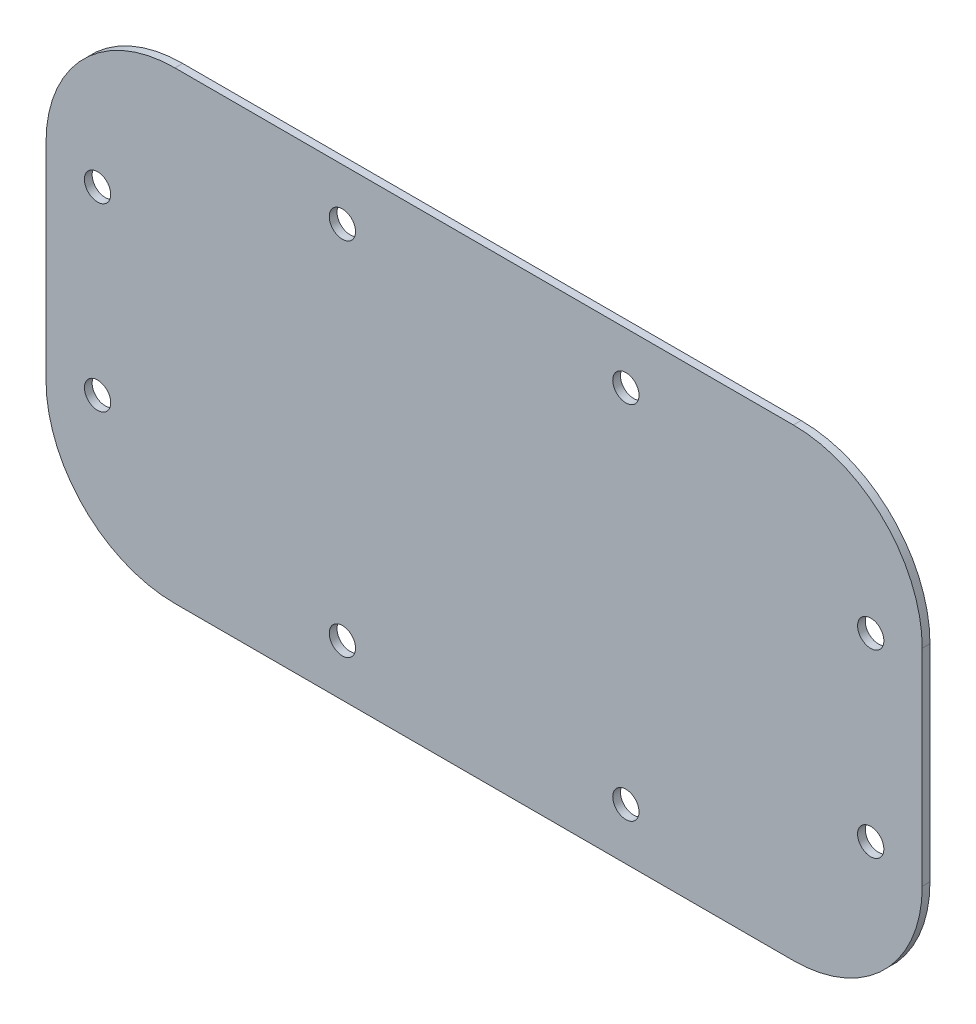
ISO-10303-21;
HEADER;
FILE_DESCRIPTION(('STEP AP214'),'2;1');
FILE_NAME('part.step','',(''),(''),'','','');
FILE_SCHEMA(('AUTOMOTIVE_DESIGN { 1 0 10303 214 1 1 1 1 }'));
ENDSEC;
DATA;
#1=APPLICATION_CONTEXT('core data for automotive mechanical design processes');
#2=APPLICATION_PROTOCOL_DEFINITION('international standard','automotive_design',2000,#1);
#3=PRODUCT_CONTEXT('',#1,'mechanical');
#4=PRODUCT('Part','Part','',(#3));
#5=PRODUCT_RELATED_PRODUCT_CATEGORY('part','',(#4));
#6=PRODUCT_DEFINITION_FORMATION('','',#4);
#7=PRODUCT_DEFINITION_CONTEXT('part definition',#1,'design');
#8=PRODUCT_DEFINITION('design','',#6,#7);
#9=PRODUCT_DEFINITION_SHAPE('','',#8);
#10=(LENGTH_UNIT() NAMED_UNIT(*) SI_UNIT(.MILLI.,.METRE.));
#11=(NAMED_UNIT(*) PLANE_ANGLE_UNIT() SI_UNIT($,.RADIAN.));
#12=(NAMED_UNIT(*) SI_UNIT($,.STERADIAN.) SOLID_ANGLE_UNIT());
#13=UNCERTAINTY_MEASURE_WITH_UNIT(LENGTH_MEASURE(1.E-05),#10,'distance_accuracy_value','');
#14=(GEOMETRIC_REPRESENTATION_CONTEXT(3) GLOBAL_UNCERTAINTY_ASSIGNED_CONTEXT((#13)) GLOBAL_UNIT_ASSIGNED_CONTEXT((#10,
#11,#12)) REPRESENTATION_CONTEXT('',''));
#15=CARTESIAN_POINT('',(0.,0.,0.));
#16=DIRECTION('',(0.,0.,1.));
#17=DIRECTION('',(1.,0.,0.));
#18=AXIS2_PLACEMENT_3D('',#15,#16,#17);
#19=CARTESIAN_POINT('',(-120.,-40.,3.));
#20=DIRECTION('',(0.,0.,-1.));
#21=DIRECTION('',(-1.,0.,0.));
#22=AXIS2_PLACEMENT_3D('',#19,#20,#21);
#23=CYLINDRICAL_SURFACE('',#22,50.);
#24=CARTESIAN_POINT('',(-120.,-40.,0.));
#25=DIRECTION('',(0.,0.,1.));
#26=DIRECTION('',(-1.,0.,0.));
#27=AXIS2_PLACEMENT_3D('',#24,#25,#26);
#28=CIRCLE('',#27,50.);
#29=CARTESIAN_POINT('',(-170.,-40.,0.));
#30=VERTEX_POINT('',#29);
#31=CARTESIAN_POINT('',(-120.,-90.,0.));
#32=VERTEX_POINT('',#31);
#33=EDGE_CURVE('E130',#30,#32,#28,.T.);
#34=ORIENTED_EDGE('',*,*,#33,.T.);
#35=DIRECTION('',(0.,0.,-1.));
#36=VECTOR('',#35,1.);
#37=CARTESIAN_POINT('',(-120.,-90.,3.));
#38=LINE('',#37,#36);
#39=CARTESIAN_POINT('',(-120.,-90.,3.));
#40=VERTEX_POINT('',#39);
#41=EDGE_CURVE('E11',#40,#32,#38,.T.);
#42=ORIENTED_EDGE('',*,*,#41,.F.);
#43=CARTESIAN_POINT('',(-120.,-40.,3.));
#44=DIRECTION('',(0.,0.,1.));
#45=DIRECTION('',(-1.,0.,0.));
#46=AXIS2_PLACEMENT_3D('',#43,#44,#45);
#47=CIRCLE('',#46,50.);
#48=CARTESIAN_POINT('',(-170.,-40.,3.));
#49=VERTEX_POINT('',#48);
#50=EDGE_CURVE('E145',#49,#40,#47,.T.);
#51=ORIENTED_EDGE('',*,*,#50,.F.);
#52=DIRECTION('',(0.,0.,-1.));
#53=VECTOR('',#52,1.);
#54=CARTESIAN_POINT('',(-170.,-40.,3.));
#55=LINE('',#54,#53);
#56=EDGE_CURVE('E126',#49,#30,#55,.T.);
#57=ORIENTED_EDGE('',*,*,#56,.T.);
#58=EDGE_LOOP('',(#34,#42,#51,#57));
#59=FACE_BOUND('',#58,.T.);
#60=ADVANCED_FACE('F34',(#59),#23,.T.);
#61=CARTESIAN_POINT('',(-120.,-90.,3.));
#62=DIRECTION('',(0.,1.,0.));
#63=DIRECTION('',(0.,0.,1.));
#64=AXIS2_PLACEMENT_3D('',#61,#62,#63);
#65=PLANE('',#64);
#66=DIRECTION('',(1.,0.,0.));
#67=VECTOR('',#66,1.);
#68=CARTESIAN_POINT('',(-120.,-90.,0.));
#69=LINE('',#68,#67);
#70=CARTESIAN_POINT('',(120.,-90.,0.));
#71=VERTEX_POINT('',#70);
#72=EDGE_CURVE('E133',#32,#71,#69,.T.);
#73=ORIENTED_EDGE('',*,*,#72,.T.);
#74=DIRECTION('',(0.,0.,-1.));
#75=VECTOR('',#74,1.);
#76=CARTESIAN_POINT('',(120.,-90.,3.));
#77=LINE('',#76,#75);
#78=CARTESIAN_POINT('',(120.,-90.,3.));
#79=VERTEX_POINT('',#78);
#80=EDGE_CURVE('E42',#79,#71,#77,.T.);
#81=ORIENTED_EDGE('',*,*,#80,.F.);
#82=DIRECTION('',(1.,0.,0.));
#83=VECTOR('',#82,1.);
#84=CARTESIAN_POINT('',(-120.,-90.,3.));
#85=LINE('',#84,#83);
#86=EDGE_CURVE('E93',#40,#79,#85,.T.);
#87=ORIENTED_EDGE('',*,*,#86,.F.);
#88=ORIENTED_EDGE('',*,*,#41,.T.);
#89=EDGE_LOOP('',(#73,#81,#87,#88));
#90=FACE_BOUND('',#89,.T.);
#91=ADVANCED_FACE('F259',(#90),#65,.F.);
#92=CARTESIAN_POINT('',(120.,-40.,3.));
#93=DIRECTION('',(0.,0.,-1.));
#94=DIRECTION('',(-1.,0.,0.));
#95=AXIS2_PLACEMENT_3D('',#92,#93,#94);
#96=CYLINDRICAL_SURFACE('',#95,50.);
#97=CARTESIAN_POINT('',(120.,-40.,0.));
#98=DIRECTION('',(0.,0.,1.));
#99=DIRECTION('',(1.,0.,0.));
#100=AXIS2_PLACEMENT_3D('',#97,#98,#99);
#101=CIRCLE('',#100,50.);
#102=CARTESIAN_POINT('',(170.,-40.,0.));
#103=VERTEX_POINT('',#102);
#104=EDGE_CURVE('E136',#71,#103,#101,.T.);
#105=ORIENTED_EDGE('',*,*,#104,.T.);
#106=DIRECTION('',(0.,0.,-1.));
#107=VECTOR('',#106,1.);
#108=CARTESIAN_POINT('',(170.,-40.,3.));
#109=LINE('',#108,#107);
#110=CARTESIAN_POINT('',(170.,-40.,3.));
#111=VERTEX_POINT('',#110);
#112=EDGE_CURVE('E152',#111,#103,#109,.T.);
#113=ORIENTED_EDGE('',*,*,#112,.F.);
#114=CARTESIAN_POINT('',(120.,-40.,3.));
#115=DIRECTION('',(0.,0.,1.));
#116=DIRECTION('',(1.,0.,0.));
#117=AXIS2_PLACEMENT_3D('',#114,#115,#116);
#118=CIRCLE('',#117,50.);
#119=EDGE_CURVE('E160',#79,#111,#118,.T.);
#120=ORIENTED_EDGE('',*,*,#119,.F.);
#121=ORIENTED_EDGE('',*,*,#80,.T.);
#122=EDGE_LOOP('',(#105,#113,#120,#121));
#123=FACE_BOUND('',#122,.T.);
#124=ADVANCED_FACE('F158',(#123),#96,.T.);
#125=CARTESIAN_POINT('',(170.,-40.,3.));
#126=DIRECTION('',(-1.,0.,0.));
#127=DIRECTION('',(0.,0.,1.));
#128=AXIS2_PLACEMENT_3D('',#125,#126,#127);
#129=PLANE('',#128);
#130=DIRECTION('',(0.,1.,0.));
#131=VECTOR('',#130,1.);
#132=CARTESIAN_POINT('',(170.,-40.,0.));
#133=LINE('',#132,#131);
#134=CARTESIAN_POINT('',(170.,40.,0.));
#135=VERTEX_POINT('',#134);
#136=EDGE_CURVE('E138',#103,#135,#133,.T.);
#137=ORIENTED_EDGE('',*,*,#136,.T.);
#138=DIRECTION('',(0.,0.,-1.));
#139=VECTOR('',#138,1.);
#140=CARTESIAN_POINT('',(170.,40.,3.));
#141=LINE('',#140,#139);
#142=CARTESIAN_POINT('',(170.,40.,3.));
#143=VERTEX_POINT('',#142);
#144=EDGE_CURVE('E149',#143,#135,#141,.T.);
#145=ORIENTED_EDGE('',*,*,#144,.F.);
#146=DIRECTION('',(0.,1.,0.));
#147=VECTOR('',#146,1.);
#148=CARTESIAN_POINT('',(170.,-40.,3.));
#149=LINE('',#148,#147);
#150=EDGE_CURVE('E172',#111,#143,#149,.T.);
#151=ORIENTED_EDGE('',*,*,#150,.F.);
#152=ORIENTED_EDGE('',*,*,#112,.T.);
#153=EDGE_LOOP('',(#137,#145,#151,#152));
#154=FACE_BOUND('',#153,.T.);
#155=ADVANCED_FACE('F168',(#154),#129,.F.);
#156=CARTESIAN_POINT('',(120.,40.,3.));
#157=DIRECTION('',(0.,0.,-1.));
#158=DIRECTION('',(-1.,0.,0.));
#159=AXIS2_PLACEMENT_3D('',#156,#157,#158);
#160=CYLINDRICAL_SURFACE('',#159,50.);
#161=CARTESIAN_POINT('',(120.,40.,0.));
#162=DIRECTION('',(0.,0.,1.));
#163=DIRECTION('',(-1.,0.,0.));
#164=AXIS2_PLACEMENT_3D('',#161,#162,#163);
#165=CIRCLE('',#164,50.);
#166=CARTESIAN_POINT('',(120.,90.,0.));
#167=VERTEX_POINT('',#166);
#168=EDGE_CURVE('E140',#135,#167,#165,.T.);
#169=ORIENTED_EDGE('',*,*,#168,.T.);
#170=DIRECTION('',(0.,0.,-1.));
#171=VECTOR('',#170,1.);
#172=CARTESIAN_POINT('',(120.,90.,3.));
#173=LINE('',#172,#171);
#174=CARTESIAN_POINT('',(120.,90.,3.));
#175=VERTEX_POINT('',#174);
#176=EDGE_CURVE('E121',#175,#167,#173,.T.);
#177=ORIENTED_EDGE('',*,*,#176,.F.);
#178=CARTESIAN_POINT('',(120.,40.,3.));
#179=DIRECTION('',(0.,0.,1.));
#180=DIRECTION('',(-1.,0.,0.));
#181=AXIS2_PLACEMENT_3D('',#178,#179,#180);
#182=CIRCLE('',#181,50.);
#183=EDGE_CURVE('E112',#143,#175,#182,.T.);
#184=ORIENTED_EDGE('',*,*,#183,.F.);
#185=ORIENTED_EDGE('',*,*,#144,.T.);
#186=EDGE_LOOP('',(#169,#177,#184,#185));
#187=FACE_BOUND('',#186,.T.);
#188=ADVANCED_FACE('F171',(#187),#160,.T.);
#189=CARTESIAN_POINT('',(-120.,90.,3.));
#190=DIRECTION('',(0.,-1.,0.));
#191=DIRECTION('',(0.,0.,-1.));
#192=AXIS2_PLACEMENT_3D('',#189,#190,#191);
#193=PLANE('',#192);
#194=DIRECTION('',(-1.,0.,0.));
#195=VECTOR('',#194,1.);
#196=CARTESIAN_POINT('',(-120.,90.,0.));
#197=LINE('',#196,#195);
#198=CARTESIAN_POINT('',(-120.,90.,0.));
#199=VERTEX_POINT('',#198);
#200=EDGE_CURVE('E120',#167,#199,#197,.T.);
#201=ORIENTED_EDGE('',*,*,#200,.T.);
#202=DIRECTION('',(0.,0.,-1.));
#203=VECTOR('',#202,1.);
#204=CARTESIAN_POINT('',(-120.,90.,3.));
#205=LINE('',#204,#203);
#206=CARTESIAN_POINT('',(-120.,90.,3.));
#207=VERTEX_POINT('',#206);
#208=EDGE_CURVE('E117',#207,#199,#205,.T.);
#209=ORIENTED_EDGE('',*,*,#208,.F.);
#210=DIRECTION('',(-1.,0.,0.));
#211=VECTOR('',#210,1.);
#212=CARTESIAN_POINT('',(-120.,90.,3.));
#213=LINE('',#212,#211);
#214=EDGE_CURVE('E106',#175,#207,#213,.T.);
#215=ORIENTED_EDGE('',*,*,#214,.F.);
#216=ORIENTED_EDGE('',*,*,#176,.T.);
#217=EDGE_LOOP('',(#201,#209,#215,#216));
#218=FACE_BOUND('',#217,.T.);
#219=ADVANCED_FACE('F118',(#218),#193,.F.);
#220=CARTESIAN_POINT('',(-120.,40.,3.));
#221=DIRECTION('',(0.,0.,-1.));
#222=DIRECTION('',(-1.,0.,0.));
#223=AXIS2_PLACEMENT_3D('',#220,#221,#222);
#224=CYLINDRICAL_SURFACE('',#223,50.);
#225=CARTESIAN_POINT('',(-120.,40.,0.));
#226=DIRECTION('',(0.,0.,1.));
#227=DIRECTION('',(-1.,0.,0.));
#228=AXIS2_PLACEMENT_3D('',#225,#226,#227);
#229=CIRCLE('',#228,50.);
#230=CARTESIAN_POINT('',(-170.,40.,0.));
#231=VERTEX_POINT('',#230);
#232=EDGE_CURVE('E79',#199,#231,#229,.T.);
#233=ORIENTED_EDGE('',*,*,#232,.T.);
#234=DIRECTION('',(0.,0.,-1.));
#235=VECTOR('',#234,1.);
#236=CARTESIAN_POINT('',(-170.,40.,3.));
#237=LINE('',#236,#235);
#238=CARTESIAN_POINT('',(-170.,40.,3.));
#239=VERTEX_POINT('',#238);
#240=EDGE_CURVE('E122',#239,#231,#237,.T.);
#241=ORIENTED_EDGE('',*,*,#240,.F.);
#242=CARTESIAN_POINT('',(-120.,40.,3.));
#243=DIRECTION('',(0.,0.,1.));
#244=DIRECTION('',(-1.,0.,0.));
#245=AXIS2_PLACEMENT_3D('',#242,#243,#244);
#246=CIRCLE('',#245,50.);
#247=EDGE_CURVE('E110',#207,#239,#246,.T.);
#248=ORIENTED_EDGE('',*,*,#247,.F.);
#249=ORIENTED_EDGE('',*,*,#208,.T.);
#250=EDGE_LOOP('',(#233,#241,#248,#249));
#251=FACE_BOUND('',#250,.T.);
#252=ADVANCED_FACE('F124',(#251),#224,.T.);
#253=CARTESIAN_POINT('',(-170.,-40.,3.));
#254=DIRECTION('',(1.,0.,0.));
#255=DIRECTION('',(0.,0.,-1.));
#256=AXIS2_PLACEMENT_3D('',#253,#254,#255);
#257=PLANE('',#256);
#258=DIRECTION('',(0.,-1.,0.));
#259=VECTOR('',#258,1.);
#260=CARTESIAN_POINT('',(-170.,-40.,0.));
#261=LINE('',#260,#259);
#262=EDGE_CURVE('E85',#231,#30,#261,.T.);
#263=ORIENTED_EDGE('',*,*,#262,.T.);
#264=ORIENTED_EDGE('',*,*,#56,.F.);
#265=DIRECTION('',(0.,-1.,0.));
#266=VECTOR('',#265,1.);
#267=CARTESIAN_POINT('',(-170.,-40.,3.));
#268=LINE('',#267,#266);
#269=EDGE_CURVE('E50',#239,#49,#268,.T.);
#270=ORIENTED_EDGE('',*,*,#269,.F.);
#271=ORIENTED_EDGE('',*,*,#240,.T.);
#272=EDGE_LOOP('',(#263,#264,#270,#271));
#273=FACE_BOUND('',#272,.T.);
#274=ADVANCED_FACE('F266',(#273),#257,.F.);
#275=CARTESIAN_POINT('',(-120.,-40.,3.));
#276=DIRECTION('',(0.,0.,-1.));
#277=DIRECTION('',(-1.,0.,0.));
#278=AXIS2_PLACEMENT_3D('',#275,#276,#277);
#279=PLANE('',#278);
#280=CARTESIAN_POINT('',(-55.,70.,3.));
#281=DIRECTION('',(0.,0.,-1.));
#282=DIRECTION('',(-1.,0.,0.));
#283=AXIS2_PLACEMENT_3D('',#280,#281,#282);
#284=CIRCLE('',#283,5.1);
#285=CARTESIAN_POINT('',(-60.1,70.,3.));
#286=VERTEX_POINT('',#285);
#287=EDGE_CURVE('E219',#286,#286,#284,.T.);
#288=ORIENTED_EDGE('',*,*,#287,.T.);
#289=EDGE_LOOP('',(#288));
#290=FACE_BOUND('',#289,.T.);
#291=CARTESIAN_POINT('',(55.,70.,3.));
#292=DIRECTION('',(0.,0.,-1.));
#293=DIRECTION('',(-1.,0.,0.));
#294=AXIS2_PLACEMENT_3D('',#291,#292,#293);
#295=CIRCLE('',#294,5.1);
#296=CARTESIAN_POINT('',(49.9,70.,3.));
#297=VERTEX_POINT('',#296);
#298=EDGE_CURVE('E213',#297,#297,#295,.T.);
#299=ORIENTED_EDGE('',*,*,#298,.T.);
#300=EDGE_LOOP('',(#299));
#301=FACE_BOUND('',#300,.T.);
#302=CARTESIAN_POINT('',(-55.,-70.,3.));
#303=DIRECTION('',(0.,0.,-1.));
#304=DIRECTION('',(-1.,0.,0.));
#305=AXIS2_PLACEMENT_3D('',#302,#303,#304);
#306=CIRCLE('',#305,5.1);
#307=CARTESIAN_POINT('',(-60.1,-70.,3.));
#308=VERTEX_POINT('',#307);
#309=EDGE_CURVE('E207',#308,#308,#306,.T.);
#310=ORIENTED_EDGE('',*,*,#309,.T.);
#311=EDGE_LOOP('',(#310));
#312=FACE_BOUND('',#311,.T.);
#313=CARTESIAN_POINT('',(55.,-70.,3.));
#314=DIRECTION('',(0.,0.,-1.));
#315=DIRECTION('',(-1.,0.,0.));
#316=AXIS2_PLACEMENT_3D('',#313,#314,#315);
#317=CIRCLE('',#316,5.1);
#318=CARTESIAN_POINT('',(49.9,-70.,3.));
#319=VERTEX_POINT('',#318);
#320=EDGE_CURVE('E201',#319,#319,#317,.T.);
#321=ORIENTED_EDGE('',*,*,#320,.T.);
#322=EDGE_LOOP('',(#321));
#323=FACE_BOUND('',#322,.T.);
#324=CARTESIAN_POINT('',(150.,35.,3.));
#325=DIRECTION('',(0.,0.,-1.));
#326=DIRECTION('',(-1.,0.,0.));
#327=AXIS2_PLACEMENT_3D('',#324,#325,#326);
#328=CIRCLE('',#327,5.09999999999999);
#329=CARTESIAN_POINT('',(144.9,35.,3.));
#330=VERTEX_POINT('',#329);
#331=EDGE_CURVE('E195',#330,#330,#328,.T.);
#332=ORIENTED_EDGE('',*,*,#331,.T.);
#333=EDGE_LOOP('',(#332));
#334=FACE_BOUND('',#333,.T.);
#335=CARTESIAN_POINT('',(150.,-35.,3.));
#336=DIRECTION('',(0.,0.,-1.));
#337=DIRECTION('',(-1.,0.,0.));
#338=AXIS2_PLACEMENT_3D('',#335,#336,#337);
#339=CIRCLE('',#338,5.09999999999999);
#340=CARTESIAN_POINT('',(144.9,-35.,3.));
#341=VERTEX_POINT('',#340);
#342=EDGE_CURVE('E189',#341,#341,#339,.T.);
#343=ORIENTED_EDGE('',*,*,#342,.T.);
#344=EDGE_LOOP('',(#343));
#345=FACE_BOUND('',#344,.T.);
#346=CARTESIAN_POINT('',(-150.,-35.,3.));
#347=DIRECTION('',(0.,0.,-1.));
#348=DIRECTION('',(-1.,0.,0.));
#349=AXIS2_PLACEMENT_3D('',#346,#347,#348);
#350=CIRCLE('',#349,5.09999999999999);
#351=CARTESIAN_POINT('',(-155.1,-35.,3.));
#352=VERTEX_POINT('',#351);
#353=EDGE_CURVE('E183',#352,#352,#350,.T.);
#354=ORIENTED_EDGE('',*,*,#353,.T.);
#355=EDGE_LOOP('',(#354));
#356=FACE_BOUND('',#355,.T.);
#357=CARTESIAN_POINT('',(-150.,35.,3.));
#358=DIRECTION('',(0.,0.,-1.));
#359=DIRECTION('',(-1.,0.,0.));
#360=AXIS2_PLACEMENT_3D('',#357,#358,#359);
#361=CIRCLE('',#360,5.09999999999999);
#362=CARTESIAN_POINT('',(-155.1,35.,3.));
#363=VERTEX_POINT('',#362);
#364=EDGE_CURVE('E134',#363,#363,#361,.T.);
#365=ORIENTED_EDGE('',*,*,#364,.T.);
#366=EDGE_LOOP('',(#365));
#367=FACE_BOUND('',#366,.T.);
#368=ORIENTED_EDGE('',*,*,#50,.T.);
#369=ORIENTED_EDGE('',*,*,#86,.T.);
#370=ORIENTED_EDGE('',*,*,#119,.T.);
#371=ORIENTED_EDGE('',*,*,#150,.T.);
#372=ORIENTED_EDGE('',*,*,#183,.T.);
#373=ORIENTED_EDGE('',*,*,#214,.T.);
#374=ORIENTED_EDGE('',*,*,#247,.T.);
#375=ORIENTED_EDGE('',*,*,#269,.T.);
#376=EDGE_LOOP('',(#368,#369,#370,#371,#372,#373,#374,#375));
#377=FACE_BOUND('',#376,.T.);
#378=ADVANCED_FACE('F108',(#290,#301,#312,#323,#334,#345,#356,#367,#377),#279,.F.);
#379=CARTESIAN_POINT('',(-120.,-40.,0.));
#380=DIRECTION('',(0.,0.,-1.));
#381=DIRECTION('',(-1.,0.,0.));
#382=AXIS2_PLACEMENT_3D('',#379,#380,#381);
#383=PLANE('',#382);
#384=CARTESIAN_POINT('',(-55.,70.,0.));
#385=DIRECTION('',(0.,0.,-1.));
#386=DIRECTION('',(-1.,0.,0.));
#387=AXIS2_PLACEMENT_3D('',#384,#385,#386);
#388=CIRCLE('',#387,5.1);
#389=CARTESIAN_POINT('',(-60.1,70.,0.));
#390=VERTEX_POINT('',#389);
#391=EDGE_CURVE('E222',#390,#390,#388,.T.);
#392=ORIENTED_EDGE('',*,*,#391,.F.);
#393=EDGE_LOOP('',(#392));
#394=FACE_BOUND('',#393,.T.);
#395=CARTESIAN_POINT('',(55.,70.,0.));
#396=DIRECTION('',(0.,0.,-1.));
#397=DIRECTION('',(-1.,0.,0.));
#398=AXIS2_PLACEMENT_3D('',#395,#396,#397);
#399=CIRCLE('',#398,5.1);
#400=CARTESIAN_POINT('',(49.9,70.,0.));
#401=VERTEX_POINT('',#400);
#402=EDGE_CURVE('E216',#401,#401,#399,.T.);
#403=ORIENTED_EDGE('',*,*,#402,.F.);
#404=EDGE_LOOP('',(#403));
#405=FACE_BOUND('',#404,.T.);
#406=CARTESIAN_POINT('',(-55.,-70.,0.));
#407=DIRECTION('',(0.,0.,-1.));
#408=DIRECTION('',(-1.,0.,0.));
#409=AXIS2_PLACEMENT_3D('',#406,#407,#408);
#410=CIRCLE('',#409,5.1);
#411=CARTESIAN_POINT('',(-60.1,-70.,0.));
#412=VERTEX_POINT('',#411);
#413=EDGE_CURVE('E210',#412,#412,#410,.T.);
#414=ORIENTED_EDGE('',*,*,#413,.F.);
#415=EDGE_LOOP('',(#414));
#416=FACE_BOUND('',#415,.T.);
#417=CARTESIAN_POINT('',(55.,-70.,0.));
#418=DIRECTION('',(0.,0.,-1.));
#419=DIRECTION('',(-1.,0.,0.));
#420=AXIS2_PLACEMENT_3D('',#417,#418,#419);
#421=CIRCLE('',#420,5.1);
#422=CARTESIAN_POINT('',(49.9,-70.,0.));
#423=VERTEX_POINT('',#422);
#424=EDGE_CURVE('E204',#423,#423,#421,.T.);
#425=ORIENTED_EDGE('',*,*,#424,.F.);
#426=EDGE_LOOP('',(#425));
#427=FACE_BOUND('',#426,.T.);
#428=CARTESIAN_POINT('',(150.,35.,0.));
#429=DIRECTION('',(0.,0.,-1.));
#430=DIRECTION('',(-1.,0.,0.));
#431=AXIS2_PLACEMENT_3D('',#428,#429,#430);
#432=CIRCLE('',#431,5.09999999999999);
#433=CARTESIAN_POINT('',(144.9,35.,0.));
#434=VERTEX_POINT('',#433);
#435=EDGE_CURVE('E198',#434,#434,#432,.T.);
#436=ORIENTED_EDGE('',*,*,#435,.F.);
#437=EDGE_LOOP('',(#436));
#438=FACE_BOUND('',#437,.T.);
#439=CARTESIAN_POINT('',(150.,-35.,0.));
#440=DIRECTION('',(0.,0.,-1.));
#441=DIRECTION('',(-1.,0.,0.));
#442=AXIS2_PLACEMENT_3D('',#439,#440,#441);
#443=CIRCLE('',#442,5.09999999999999);
#444=CARTESIAN_POINT('',(144.9,-35.,0.));
#445=VERTEX_POINT('',#444);
#446=EDGE_CURVE('E192',#445,#445,#443,.T.);
#447=ORIENTED_EDGE('',*,*,#446,.F.);
#448=EDGE_LOOP('',(#447));
#449=FACE_BOUND('',#448,.T.);
#450=CARTESIAN_POINT('',(-150.,-35.,0.));
#451=DIRECTION('',(0.,0.,-1.));
#452=DIRECTION('',(-1.,0.,0.));
#453=AXIS2_PLACEMENT_3D('',#450,#451,#452);
#454=CIRCLE('',#453,5.09999999999999);
#455=CARTESIAN_POINT('',(-155.1,-35.,0.));
#456=VERTEX_POINT('',#455);
#457=EDGE_CURVE('E186',#456,#456,#454,.T.);
#458=ORIENTED_EDGE('',*,*,#457,.F.);
#459=EDGE_LOOP('',(#458));
#460=FACE_BOUND('',#459,.T.);
#461=CARTESIAN_POINT('',(-150.,35.,0.));
#462=DIRECTION('',(0.,0.,-1.));
#463=DIRECTION('',(-1.,0.,0.));
#464=AXIS2_PLACEMENT_3D('',#461,#462,#463);
#465=CIRCLE('',#464,5.09999999999999);
#466=CARTESIAN_POINT('',(-155.1,35.,0.));
#467=VERTEX_POINT('',#466);
#468=EDGE_CURVE('E180',#467,#467,#465,.T.);
#469=ORIENTED_EDGE('',*,*,#468,.F.);
#470=EDGE_LOOP('',(#469));
#471=FACE_BOUND('',#470,.T.);
#472=ORIENTED_EDGE('',*,*,#33,.F.);
#473=ORIENTED_EDGE('',*,*,#262,.F.);
#474=ORIENTED_EDGE('',*,*,#232,.F.);
#475=ORIENTED_EDGE('',*,*,#200,.F.);
#476=ORIENTED_EDGE('',*,*,#168,.F.);
#477=ORIENTED_EDGE('',*,*,#136,.F.);
#478=ORIENTED_EDGE('',*,*,#104,.F.);
#479=ORIENTED_EDGE('',*,*,#72,.F.);
#480=EDGE_LOOP('',(#472,#473,#474,#475,#476,#477,#478,#479));
#481=FACE_BOUND('',#480,.T.);
#482=ADVANCED_FACE('F164',(#394,#405,#416,#427,#438,#449,#460,#471,#481),#383,.T.);
#483=CARTESIAN_POINT('',(-150.,35.,0.));
#484=DIRECTION('',(0.,0.,-1.));
#485=DIRECTION('',(-1.,0.,0.));
#486=AXIS2_PLACEMENT_3D('',#483,#484,#485);
#487=CYLINDRICAL_SURFACE('',#486,5.09999999999999);
#488=ORIENTED_EDGE('',*,*,#364,.F.);
#489=EDGE_LOOP('',(#488));
#490=FACE_BOUND('',#489,.T.);
#491=ORIENTED_EDGE('',*,*,#468,.T.);
#492=EDGE_LOOP('',(#491));
#493=FACE_BOUND('',#492,.T.);
#494=ADVANCED_FACE('F230',(#490,#493),#487,.F.);
#495=CARTESIAN_POINT('',(-150.,-35.,0.));
#496=DIRECTION('',(0.,0.,-1.));
#497=DIRECTION('',(-1.,0.,0.));
#498=AXIS2_PLACEMENT_3D('',#495,#496,#497);
#499=CYLINDRICAL_SURFACE('',#498,5.09999999999999);
#500=ORIENTED_EDGE('',*,*,#353,.F.);
#501=EDGE_LOOP('',(#500));
#502=FACE_BOUND('',#501,.T.);
#503=ORIENTED_EDGE('',*,*,#457,.T.);
#504=EDGE_LOOP('',(#503));
#505=FACE_BOUND('',#504,.T.);
#506=ADVANCED_FACE('F247',(#502,#505),#499,.F.);
#507=CARTESIAN_POINT('',(150.,-35.,0.));
#508=DIRECTION('',(0.,0.,-1.));
#509=DIRECTION('',(-1.,0.,0.));
#510=AXIS2_PLACEMENT_3D('',#507,#508,#509);
#511=CYLINDRICAL_SURFACE('',#510,5.09999999999999);
#512=ORIENTED_EDGE('',*,*,#342,.F.);
#513=EDGE_LOOP('',(#512));
#514=FACE_BOUND('',#513,.T.);
#515=ORIENTED_EDGE('',*,*,#446,.T.);
#516=EDGE_LOOP('',(#515));
#517=FACE_BOUND('',#516,.T.);
#518=ADVANCED_FACE('F253',(#514,#517),#511,.F.);
#519=CARTESIAN_POINT('',(150.,35.,0.));
#520=DIRECTION('',(0.,0.,-1.));
#521=DIRECTION('',(-1.,0.,0.));
#522=AXIS2_PLACEMENT_3D('',#519,#520,#521);
#523=CYLINDRICAL_SURFACE('',#522,5.09999999999999);
#524=ORIENTED_EDGE('',*,*,#331,.F.);
#525=EDGE_LOOP('',(#524));
#526=FACE_BOUND('',#525,.T.);
#527=ORIENTED_EDGE('',*,*,#435,.T.);
#528=EDGE_LOOP('',(#527));
#529=FACE_BOUND('',#528,.T.);
#530=ADVANCED_FACE('F338',(#526,#529),#523,.F.);
#531=CARTESIAN_POINT('',(55.,-70.,0.));
#532=DIRECTION('',(0.,0.,-1.));
#533=DIRECTION('',(-1.,0.,0.));
#534=AXIS2_PLACEMENT_3D('',#531,#532,#533);
#535=CYLINDRICAL_SURFACE('',#534,5.1);
#536=ORIENTED_EDGE('',*,*,#320,.F.);
#537=EDGE_LOOP('',(#536));
#538=FACE_BOUND('',#537,.T.);
#539=ORIENTED_EDGE('',*,*,#424,.T.);
#540=EDGE_LOOP('',(#539));
#541=FACE_BOUND('',#540,.T.);
#542=ADVANCED_FACE('F348',(#538,#541),#535,.F.);
#543=CARTESIAN_POINT('',(-55.,-70.,0.));
#544=DIRECTION('',(0.,0.,-1.));
#545=DIRECTION('',(-1.,0.,0.));
#546=AXIS2_PLACEMENT_3D('',#543,#544,#545);
#547=CYLINDRICAL_SURFACE('',#546,5.1);
#548=ORIENTED_EDGE('',*,*,#309,.F.);
#549=EDGE_LOOP('',(#548));
#550=FACE_BOUND('',#549,.T.);
#551=ORIENTED_EDGE('',*,*,#413,.T.);
#552=EDGE_LOOP('',(#551));
#553=FACE_BOUND('',#552,.T.);
#554=ADVANCED_FACE('F358',(#550,#553),#547,.F.);
#555=CARTESIAN_POINT('',(55.,70.,0.));
#556=DIRECTION('',(0.,0.,-1.));
#557=DIRECTION('',(-1.,0.,0.));
#558=AXIS2_PLACEMENT_3D('',#555,#556,#557);
#559=CYLINDRICAL_SURFACE('',#558,5.1);
#560=ORIENTED_EDGE('',*,*,#298,.F.);
#561=EDGE_LOOP('',(#560));
#562=FACE_BOUND('',#561,.T.);
#563=ORIENTED_EDGE('',*,*,#402,.T.);
#564=EDGE_LOOP('',(#563));
#565=FACE_BOUND('',#564,.T.);
#566=ADVANCED_FACE('F368',(#562,#565),#559,.F.);
#567=CARTESIAN_POINT('',(-55.,70.,0.));
#568=DIRECTION('',(0.,0.,-1.));
#569=DIRECTION('',(-1.,0.,0.));
#570=AXIS2_PLACEMENT_3D('',#567,#568,#569);
#571=CYLINDRICAL_SURFACE('',#570,5.1);
#572=ORIENTED_EDGE('',*,*,#287,.F.);
#573=EDGE_LOOP('',(#572));
#574=FACE_BOUND('',#573,.T.);
#575=ORIENTED_EDGE('',*,*,#391,.T.);
#576=EDGE_LOOP('',(#575));
#577=FACE_BOUND('',#576,.T.);
#578=ADVANCED_FACE('F226',(#574,#577),#571,.F.);
#579=CLOSED_SHELL('',(#60,#91,#124,#155,#188,#219,#252,#274,#378,#482,#494,#506,#518,#530,#542,
#554,#566,#578));
#580=MANIFOLD_SOLID_BREP('B2',#579);
#581=ADVANCED_BREP_SHAPE_REPRESENTATION('',(#18,#580),#14);
#582=SHAPE_DEFINITION_REPRESENTATION(#9,#581);
ENDSEC;
END-ISO-10303-21;
